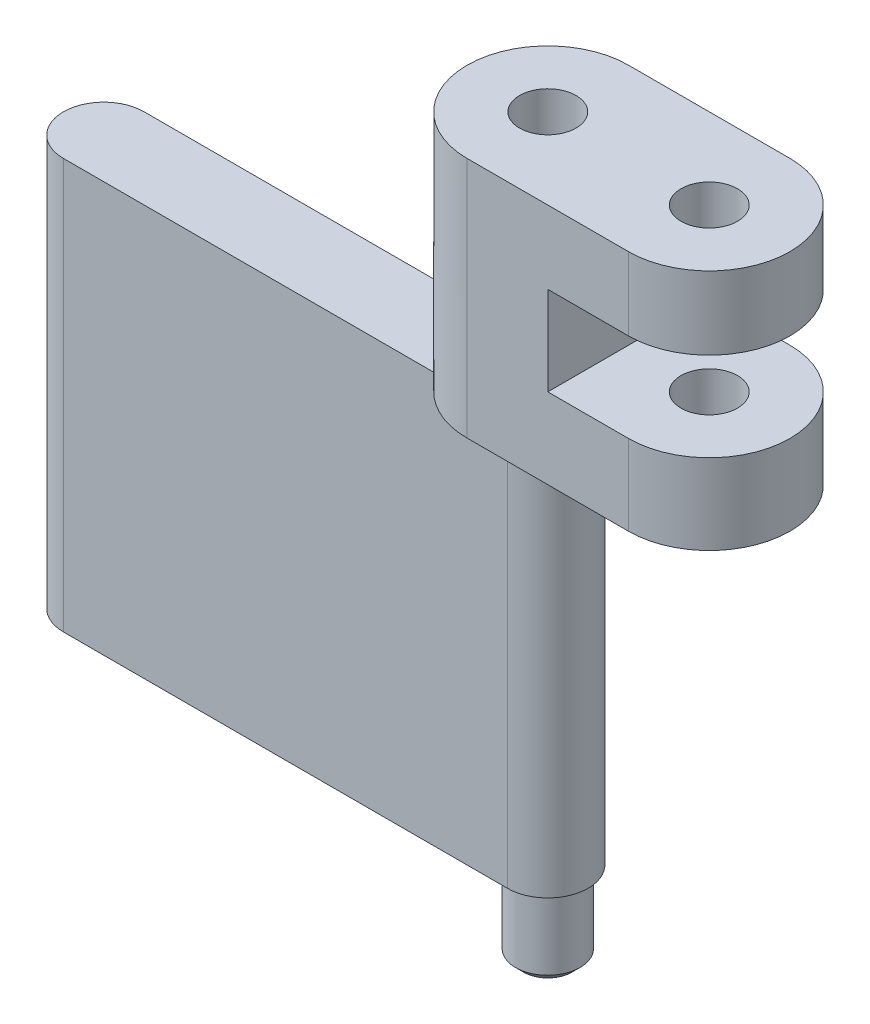
ISO-10303-21;
HEADER;
FILE_DESCRIPTION(('STEP AP214'),'2;1');
FILE_NAME('part.step','',(''),(''),'','','');
FILE_SCHEMA(('AUTOMOTIVE_DESIGN { 1 0 10303 214 1 1 1 1 }'));
ENDSEC;
DATA;
#1=APPLICATION_CONTEXT('core data for automotive mechanical design processes');
#2=APPLICATION_PROTOCOL_DEFINITION('international standard','automotive_design',2000,#1);
#3=PRODUCT_CONTEXT('',#1,'mechanical');
#4=PRODUCT('Part','Part','',(#3));
#5=PRODUCT_RELATED_PRODUCT_CATEGORY('part','',(#4));
#6=PRODUCT_DEFINITION_FORMATION('','',#4);
#7=PRODUCT_DEFINITION_CONTEXT('part definition',#1,'design');
#8=PRODUCT_DEFINITION('design','',#6,#7);
#9=PRODUCT_DEFINITION_SHAPE('','',#8);
#10=(LENGTH_UNIT() NAMED_UNIT(*) SI_UNIT(.MILLI.,.METRE.));
#11=(NAMED_UNIT(*) PLANE_ANGLE_UNIT() SI_UNIT($,.RADIAN.));
#12=(NAMED_UNIT(*) SI_UNIT($,.STERADIAN.) SOLID_ANGLE_UNIT());
#13=UNCERTAINTY_MEASURE_WITH_UNIT(LENGTH_MEASURE(1.E-05),#10,'distance_accuracy_value','');
#14=(GEOMETRIC_REPRESENTATION_CONTEXT(3) GLOBAL_UNCERTAINTY_ASSIGNED_CONTEXT((#13)) GLOBAL_UNIT_ASSIGNED_CONTEXT((#10,
#11,#12)) REPRESENTATION_CONTEXT('',''));
#15=CARTESIAN_POINT('',(0.,0.,0.));
#16=DIRECTION('',(0.,0.,1.));
#17=DIRECTION('',(1.,0.,0.));
#18=AXIS2_PLACEMENT_3D('',#15,#16,#17);
#19=CARTESIAN_POINT('',(10.,30.,0.));
#20=DIRECTION('',(0.,-1.,0.));
#21=DIRECTION('',(0.,0.,-1.));
#22=AXIS2_PLACEMENT_3D('',#19,#20,#21);
#23=CYLINDRICAL_SURFACE('',#22,10.);
#24=DIRECTION('',(0.,-1.,0.));
#25=VECTOR('',#24,1.);
#26=CARTESIAN_POINT('',(10.,30.,10.));
#27=LINE('',#26,#25);
#28=CARTESIAN_POINT('',(10.,30.,10.));
#29=VERTEX_POINT('',#28);
#30=CARTESIAN_POINT('',(10.,20.9567202086117,10.));
#31=VERTEX_POINT('',#30);
#32=EDGE_CURVE('E284',#29,#31,#27,.T.);
#33=ORIENTED_EDGE('',*,*,#32,.T.);
#34=CARTESIAN_POINT('',(10.,20.9567202086117,0.));
#35=DIRECTION('',(0.,1.,0.));
#36=DIRECTION('',(0.,0.,1.));
#37=AXIS2_PLACEMENT_3D('',#34,#35,#36);
#38=CIRCLE('',#37,10.);
#39=CARTESIAN_POINT('',(10.,20.9567202086117,-10.));
#40=VERTEX_POINT('',#39);
#41=EDGE_CURVE('E205',#31,#40,#38,.T.);
#42=ORIENTED_EDGE('',*,*,#41,.T.);
#43=DIRECTION('',(0.,-1.,0.));
#44=VECTOR('',#43,1.);
#45=CARTESIAN_POINT('',(10.,30.,-10.));
#46=LINE('',#45,#44);
#47=CARTESIAN_POINT('',(10.,30.,-10.));
#48=VERTEX_POINT('',#47);
#49=EDGE_CURVE('E281',#48,#40,#46,.T.);
#50=ORIENTED_EDGE('',*,*,#49,.F.);
#51=CARTESIAN_POINT('',(10.,30.,0.));
#52=DIRECTION('',(0.,1.,0.));
#53=DIRECTION('',(0.,0.,1.));
#54=AXIS2_PLACEMENT_3D('',#51,#52,#53);
#55=CIRCLE('',#54,10.);
#56=EDGE_CURVE('E262',#29,#48,#55,.T.);
#57=ORIENTED_EDGE('',*,*,#56,.F.);
#58=EDGE_LOOP('',(#33,#42,#50,#57));
#59=FACE_BOUND('',#58,.T.);
#60=ADVANCED_FACE('F75',(#59),#23,.T.);
#61=CARTESIAN_POINT('',(10.,30.,0.));
#62=DIRECTION('',(0.,-1.,0.));
#63=DIRECTION('',(0.,0.,-1.));
#64=AXIS2_PLACEMENT_3D('',#61,#62,#63);
#65=CYLINDRICAL_SURFACE('',#64,3.5);
#66=CARTESIAN_POINT('',(10.,20.9567202086117,0.));
#67=DIRECTION('',(0.,1.,0.));
#68=DIRECTION('',(0.,0.,1.));
#69=AXIS2_PLACEMENT_3D('',#66,#67,#68);
#70=CIRCLE('',#69,3.5);
#71=CARTESIAN_POINT('',(10.,20.9567202086117,3.5));
#72=VERTEX_POINT('',#71);
#73=EDGE_CURVE('E80',#72,#72,#70,.T.);
#74=ORIENTED_EDGE('',*,*,#73,.F.);
#75=EDGE_LOOP('',(#74));
#76=FACE_BOUND('',#75,.T.);
#77=CARTESIAN_POINT('',(10.,30.,0.));
#78=DIRECTION('',(0.,1.,0.));
#79=DIRECTION('',(0.,0.,1.));
#80=AXIS2_PLACEMENT_3D('',#77,#78,#79);
#81=CIRCLE('',#80,3.5);
#82=CARTESIAN_POINT('',(10.,30.,3.5));
#83=VERTEX_POINT('',#82);
#84=EDGE_CURVE('E244',#83,#83,#81,.T.);
#85=ORIENTED_EDGE('',*,*,#84,.T.);
#86=EDGE_LOOP('',(#85));
#87=FACE_BOUND('',#86,.T.);
#88=ADVANCED_FACE('F301',(#76,#87),#65,.F.);
#89=CARTESIAN_POINT('',(-10.,0.,0.));
#90=DIRECTION('',(0.,1.,0.));
#91=DIRECTION('',(0.,0.,1.));
#92=AXIS2_PLACEMENT_3D('',#89,#90,#91);
#93=PLANE('',#92);
#94=CARTESIAN_POINT('',(10.,0.,0.));
#95=DIRECTION('',(0.,1.,0.));
#96=DIRECTION('',(0.,0.,1.));
#97=AXIS2_PLACEMENT_3D('',#94,#95,#96);
#98=CIRCLE('',#97,3.5);
#99=CARTESIAN_POINT('',(10.,0.,3.5));
#100=VERTEX_POINT('',#99);
#101=EDGE_CURVE('E243',#100,#100,#98,.T.);
#102=ORIENTED_EDGE('',*,*,#101,.T.);
#103=EDGE_LOOP('',(#102));
#104=FACE_BOUND('',#103,.T.);
#105=DIRECTION('',(1.,0.,0.));
#106=VECTOR('',#105,1.);
#107=CARTESIAN_POINT('',(-10.,0.,-5.));
#108=LINE('',#107,#106);
#109=CARTESIAN_POINT('',(-18.6602540378444,0.,-5.));
#110=VERTEX_POINT('',#109);
#111=CARTESIAN_POINT('',(-10.,0.,-5.));
#112=VERTEX_POINT('',#111);
#113=EDGE_CURVE('E231',#110,#112,#108,.T.);
#114=ORIENTED_EDGE('',*,*,#113,.F.);
#115=CARTESIAN_POINT('',(-10.,0.,0.));
#116=DIRECTION('',(0.,1.,0.));
#117=DIRECTION('',(0.,0.,1.));
#118=AXIS2_PLACEMENT_3D('',#115,#116,#117);
#119=CIRCLE('',#118,10.);
#120=CARTESIAN_POINT('',(-10.,0.,-10.));
#121=VERTEX_POINT('',#120);
#122=EDGE_CURVE('E268',#121,#110,#119,.T.);
#123=ORIENTED_EDGE('',*,*,#122,.F.);
#124=DIRECTION('',(1.,0.,0.));
#125=VECTOR('',#124,1.);
#126=CARTESIAN_POINT('',(-10.,0.,-10.));
#127=LINE('',#126,#125);
#128=CARTESIAN_POINT('',(10.,0.,-10.));
#129=VERTEX_POINT('',#128);
#130=EDGE_CURVE('E260',#121,#129,#127,.T.);
#131=ORIENTED_EDGE('',*,*,#130,.T.);
#132=CARTESIAN_POINT('',(10.,0.,0.));
#133=DIRECTION('',(0.,1.,0.));
#134=DIRECTION('',(0.,0.,1.));
#135=AXIS2_PLACEMENT_3D('',#132,#133,#134);
#136=CIRCLE('',#135,10.);
#137=CARTESIAN_POINT('',(10.,0.,10.));
#138=VERTEX_POINT('',#137);
#139=EDGE_CURVE('E274',#138,#129,#136,.T.);
#140=ORIENTED_EDGE('',*,*,#139,.F.);
#141=DIRECTION('',(1.,0.,0.));
#142=VECTOR('',#141,1.);
#143=CARTESIAN_POINT('',(-10.,0.,10.));
#144=LINE('',#143,#142);
#145=CARTESIAN_POINT('',(-10.,0.,10.));
#146=VERTEX_POINT('',#145);
#147=EDGE_CURVE('E271',#146,#138,#144,.T.);
#148=ORIENTED_EDGE('',*,*,#147,.F.);
#149=CARTESIAN_POINT('',(-18.6602540378444,0.,5.));
#150=VERTEX_POINT('',#149);
#151=EDGE_CURVE('E253',#150,#146,#119,.T.);
#152=ORIENTED_EDGE('',*,*,#151,.F.);
#153=DIRECTION('',(-1.,0.,0.));
#154=VECTOR('',#153,1.);
#155=CARTESIAN_POINT('',(-10.,0.,5.));
#156=LINE('',#155,#154);
#157=CARTESIAN_POINT('',(-10.,0.,5.));
#158=VERTEX_POINT('',#157);
#159=EDGE_CURVE('E224',#158,#150,#156,.T.);
#160=ORIENTED_EDGE('',*,*,#159,.F.);
#161=CARTESIAN_POINT('',(-10.,0.,0.));
#162=DIRECTION('',(0.,-1.,0.));
#163=DIRECTION('',(0.,0.,-1.));
#164=AXIS2_PLACEMENT_3D('',#161,#162,#163);
#165=CIRCLE('',#164,5.);
#166=EDGE_CURVE('E101',#112,#158,#165,.T.);
#167=ORIENTED_EDGE('',*,*,#166,.F.);
#168=EDGE_LOOP('',(#114,#123,#131,#140,#148,#152,#160,#167));
#169=FACE_BOUND('',#168,.T.);
#170=ADVANCED_FACE('F304',(#104,#169),#93,.F.);
#171=CARTESIAN_POINT('',(-10.,30.,0.));
#172=DIRECTION('',(0.,1.,0.));
#173=DIRECTION('',(0.,0.,1.));
#174=AXIS2_PLACEMENT_3D('',#171,#172,#173);
#175=PLANE('',#174);
#176=CARTESIAN_POINT('',(-10.,30.,0.));
#177=DIRECTION('',(0.,1.,0.));
#178=DIRECTION('',(0.,0.,1.));
#179=AXIS2_PLACEMENT_3D('',#176,#177,#178);
#180=CIRCLE('',#179,3.5);
#181=CARTESIAN_POINT('',(-10.,30.,3.5));
#182=VERTEX_POINT('',#181);
#183=EDGE_CURVE('E250',#182,#182,#180,.T.);
#184=ORIENTED_EDGE('',*,*,#183,.F.);
#185=EDGE_LOOP('',(#184));
#186=FACE_BOUND('',#185,.T.);
#187=CARTESIAN_POINT('',(-10.,30.,0.));
#188=DIRECTION('',(0.,1.,0.));
#189=DIRECTION('',(0.,0.,1.));
#190=AXIS2_PLACEMENT_3D('',#187,#188,#189);
#191=CIRCLE('',#190,10.);
#192=CARTESIAN_POINT('',(-10.,30.,-10.));
#193=VERTEX_POINT('',#192);
#194=CARTESIAN_POINT('',(-10.,30.,10.));
#195=VERTEX_POINT('',#194);
#196=EDGE_CURVE('E256',#193,#195,#191,.T.);
#197=ORIENTED_EDGE('',*,*,#196,.T.);
#198=DIRECTION('',(1.,0.,0.));
#199=VECTOR('',#198,1.);
#200=CARTESIAN_POINT('',(-10.,30.,10.));
#201=LINE('',#200,#199);
#202=EDGE_CURVE('E259',#195,#29,#201,.T.);
#203=ORIENTED_EDGE('',*,*,#202,.T.);
#204=ORIENTED_EDGE('',*,*,#56,.T.);
#205=DIRECTION('',(1.,0.,0.));
#206=VECTOR('',#205,1.);
#207=CARTESIAN_POINT('',(-10.,30.,-10.));
#208=LINE('',#207,#206);
#209=EDGE_CURVE('E264',#193,#48,#208,.T.);
#210=ORIENTED_EDGE('',*,*,#209,.F.);
#211=EDGE_LOOP('',(#197,#203,#204,#210));
#212=FACE_BOUND('',#211,.T.);
#213=ORIENTED_EDGE('',*,*,#84,.F.);
#214=EDGE_LOOP('',(#213));
#215=FACE_BOUND('',#214,.T.);
#216=ADVANCED_FACE('F306',(#186,#212,#215),#175,.T.);
#217=CARTESIAN_POINT('',(-10.,30.,0.));
#218=DIRECTION('',(0.,-1.,0.));
#219=DIRECTION('',(0.,0.,-1.));
#220=AXIS2_PLACEMENT_3D('',#217,#218,#219);
#221=CYLINDRICAL_SURFACE('',#220,10.);
#222=ORIENTED_EDGE('',*,*,#122,.T.);
#223=EDGE_CURVE('E272',#110,#150,#119,.T.);
#224=ORIENTED_EDGE('',*,*,#223,.T.);
#225=ORIENTED_EDGE('',*,*,#151,.T.);
#226=DIRECTION('',(0.,-1.,0.));
#227=VECTOR('',#226,1.);
#228=CARTESIAN_POINT('',(-10.,30.,10.));
#229=LINE('',#228,#227);
#230=EDGE_CURVE('E287',#195,#146,#229,.T.);
#231=ORIENTED_EDGE('',*,*,#230,.F.);
#232=ORIENTED_EDGE('',*,*,#196,.F.);
#233=DIRECTION('',(0.,-1.,0.));
#234=VECTOR('',#233,1.);
#235=CARTESIAN_POINT('',(-10.,30.,-10.));
#236=LINE('',#235,#234);
#237=EDGE_CURVE('E267',#193,#121,#236,.T.);
#238=ORIENTED_EDGE('',*,*,#237,.T.);
#239=EDGE_LOOP('',(#222,#224,#225,#231,#232,#238));
#240=FACE_BOUND('',#239,.T.);
#241=ADVANCED_FACE('F314',(#240),#221,.T.);
#242=CARTESIAN_POINT('',(-10.,30.,10.));
#243=DIRECTION('',(0.,0.,-1.));
#244=DIRECTION('',(-1.,0.,0.));
#245=AXIS2_PLACEMENT_3D('',#242,#243,#244);
#246=PLANE('',#245);
#247=DIRECTION('',(0.,1.,0.));
#248=VECTOR('',#247,1.);
#249=CARTESIAN_POINT('',(0.,20.9567202086117,10.));
#250=LINE('',#249,#248);
#251=CARTESIAN_POINT('',(0.,9.95672020861171,10.));
#252=VERTEX_POINT('',#251);
#253=CARTESIAN_POINT('',(0.,20.9567202086117,10.));
#254=VERTEX_POINT('',#253);
#255=EDGE_CURVE('E184',#252,#254,#250,.T.);
#256=ORIENTED_EDGE('',*,*,#255,.T.);
#257=DIRECTION('',(1.,0.,0.));
#258=VECTOR('',#257,1.);
#259=CARTESIAN_POINT('',(30.,20.9567202086117,10.));
#260=LINE('',#259,#258);
#261=EDGE_CURVE('E181',#254,#31,#260,.T.);
#262=ORIENTED_EDGE('',*,*,#261,.T.);
#263=ORIENTED_EDGE('',*,*,#32,.F.);
#264=ORIENTED_EDGE('',*,*,#202,.F.);
#265=ORIENTED_EDGE('',*,*,#230,.T.);
#266=ORIENTED_EDGE('',*,*,#147,.T.);
#267=CARTESIAN_POINT('',(10.,9.95672020861171,10.));
#268=VERTEX_POINT('',#267);
#269=EDGE_CURVE('E193',#268,#138,#27,.T.);
#270=ORIENTED_EDGE('',*,*,#269,.F.);
#271=DIRECTION('',(-1.,0.,0.));
#272=VECTOR('',#271,1.);
#273=CARTESIAN_POINT('',(30.,9.95672020861171,10.));
#274=LINE('',#273,#272);
#275=EDGE_CURVE('E175',#268,#252,#274,.T.);
#276=ORIENTED_EDGE('',*,*,#275,.T.);
#277=EDGE_LOOP('',(#256,#262,#263,#264,#265,#266,#270,#276));
#278=FACE_BOUND('',#277,.T.);
#279=ADVANCED_FACE('F191',(#278),#246,.F.);
#280=CARTESIAN_POINT('',(10.,9.95672020861171,-10.));
#281=VERTEX_POINT('',#280);
#282=EDGE_CURVE('E280',#281,#129,#46,.T.);
#283=ORIENTED_EDGE('',*,*,#282,.F.);
#284=CARTESIAN_POINT('',(10.,9.95672020861171,0.));
#285=DIRECTION('',(0.,-1.,0.));
#286=DIRECTION('',(0.,0.,-1.));
#287=AXIS2_PLACEMENT_3D('',#284,#285,#286);
#288=CIRCLE('',#287,10.);
#289=EDGE_CURVE('E93',#281,#268,#288,.T.);
#290=ORIENTED_EDGE('',*,*,#289,.T.);
#291=ORIENTED_EDGE('',*,*,#269,.T.);
#292=ORIENTED_EDGE('',*,*,#139,.T.);
#293=EDGE_LOOP('',(#283,#290,#291,#292));
#294=FACE_BOUND('',#293,.T.);
#295=ADVANCED_FACE('F345',(#294),#23,.T.);
#296=CARTESIAN_POINT('',(-10.,30.,-10.));
#297=DIRECTION('',(0.,0.,-1.));
#298=DIRECTION('',(-1.,0.,0.));
#299=AXIS2_PLACEMENT_3D('',#296,#297,#298);
#300=PLANE('',#299);
#301=DIRECTION('',(1.,0.,0.));
#302=VECTOR('',#301,1.);
#303=CARTESIAN_POINT('',(30.,20.9567202086117,-10.));
#304=LINE('',#303,#302);
#305=CARTESIAN_POINT('',(0.,20.9567202086117,-10.));
#306=VERTEX_POINT('',#305);
#307=EDGE_CURVE('E194',#306,#40,#304,.T.);
#308=ORIENTED_EDGE('',*,*,#307,.F.);
#309=DIRECTION('',(0.,1.,0.));
#310=VECTOR('',#309,1.);
#311=CARTESIAN_POINT('',(0.,20.9567202086117,-10.));
#312=LINE('',#311,#310);
#313=CARTESIAN_POINT('',(0.,9.95672020861171,-10.));
#314=VERTEX_POINT('',#313);
#315=EDGE_CURVE('E196',#314,#306,#312,.T.);
#316=ORIENTED_EDGE('',*,*,#315,.F.);
#317=DIRECTION('',(-1.,0.,0.));
#318=VECTOR('',#317,1.);
#319=CARTESIAN_POINT('',(30.,9.95672020861171,-10.));
#320=LINE('',#319,#318);
#321=EDGE_CURVE('E176',#281,#314,#320,.T.);
#322=ORIENTED_EDGE('',*,*,#321,.F.);
#323=ORIENTED_EDGE('',*,*,#282,.T.);
#324=ORIENTED_EDGE('',*,*,#130,.F.);
#325=ORIENTED_EDGE('',*,*,#237,.F.);
#326=ORIENTED_EDGE('',*,*,#209,.T.);
#327=ORIENTED_EDGE('',*,*,#49,.T.);
#328=EDGE_LOOP('',(#308,#316,#322,#323,#324,#325,#326,#327));
#329=FACE_BOUND('',#328,.T.);
#330=ADVANCED_FACE('F342',(#329),#300,.T.);
#331=CARTESIAN_POINT('',(-10.,30.,0.));
#332=DIRECTION('',(0.,-1.,0.));
#333=DIRECTION('',(0.,0.,-1.));
#334=AXIS2_PLACEMENT_3D('',#331,#332,#333);
#335=CYLINDRICAL_SURFACE('',#334,3.5);
#336=ORIENTED_EDGE('',*,*,#183,.T.);
#337=EDGE_LOOP('',(#336));
#338=FACE_BOUND('',#337,.T.);
#339=CARTESIAN_POINT('',(-10.,0.,0.));
#340=DIRECTION('',(0.,1.,0.));
#341=DIRECTION('',(0.,0.,1.));
#342=AXIS2_PLACEMENT_3D('',#339,#340,#341);
#343=CIRCLE('',#342,3.5);
#344=CARTESIAN_POINT('',(-10.,0.,3.5));
#345=VERTEX_POINT('',#344);
#346=EDGE_CURVE('E247',#345,#345,#343,.T.);
#347=ORIENTED_EDGE('',*,*,#346,.F.);
#348=EDGE_LOOP('',(#347));
#349=FACE_BOUND('',#348,.T.);
#350=ADVANCED_FACE('F299',(#338,#349),#335,.F.);
#351=CARTESIAN_POINT('',(10.,9.95672020861171,0.));
#352=DIRECTION('',(0.,-1.,0.));
#353=DIRECTION('',(0.,0.,-1.));
#354=AXIS2_PLACEMENT_3D('',#351,#352,#353);
#355=CIRCLE('',#354,3.5);
#356=CARTESIAN_POINT('',(10.,9.95672020861171,-3.5));
#357=VERTEX_POINT('',#356);
#358=EDGE_CURVE('E202',#357,#357,#355,.T.);
#359=ORIENTED_EDGE('',*,*,#358,.F.);
#360=EDGE_LOOP('',(#359));
#361=FACE_BOUND('',#360,.T.);
#362=ORIENTED_EDGE('',*,*,#101,.F.);
#363=EDGE_LOOP('',(#362));
#364=FACE_BOUND('',#363,.T.);
#365=ADVANCED_FACE('F295',(#361,#364),#65,.F.);
#366=CARTESIAN_POINT('',(-10.,0.,0.));
#367=DIRECTION('',(0.,-1.,0.));
#368=DIRECTION('',(0.,0.,-1.));
#369=AXIS2_PLACEMENT_3D('',#366,#367,#368);
#370=PLANE('',#369);
#371=ORIENTED_EDGE('',*,*,#223,.F.);
#372=CARTESIAN_POINT('',(-65.,0.,-5.));
#373=VERTEX_POINT('',#372);
#374=EDGE_CURVE('E215',#373,#110,#108,.T.);
#375=ORIENTED_EDGE('',*,*,#374,.F.);
#376=CARTESIAN_POINT('',(-65.,0.,0.));
#377=DIRECTION('',(0.,-1.,0.));
#378=DIRECTION('',(0.,0.,-1.));
#379=AXIS2_PLACEMENT_3D('',#376,#377,#378);
#380=CIRCLE('',#379,5.);
#381=CARTESIAN_POINT('',(-65.,0.,4.99999999999999));
#382=VERTEX_POINT('',#381);
#383=EDGE_CURVE('E227',#382,#373,#380,.T.);
#384=ORIENTED_EDGE('',*,*,#383,.F.);
#385=EDGE_CURVE('E223',#150,#382,#156,.T.);
#386=ORIENTED_EDGE('',*,*,#385,.F.);
#387=EDGE_LOOP('',(#371,#375,#384,#386));
#388=FACE_BOUND('',#387,.T.);
#389=ADVANCED_FACE('F298',(#388),#370,.F.);
#390=CARTESIAN_POINT('',(-10.,-50.8,0.));
#391=DIRECTION('',(0.,-1.,0.));
#392=DIRECTION('',(0.,0.,-1.));
#393=AXIS2_PLACEMENT_3D('',#390,#391,#392);
#394=PLANE('',#393);
#395=CARTESIAN_POINT('',(-10.,-50.8,0.));
#396=DIRECTION('',(0.,-1.,0.));
#397=DIRECTION('',(0.,0.,-1.));
#398=AXIS2_PLACEMENT_3D('',#395,#396,#397);
#399=CIRCLE('',#398,4.);
#400=CARTESIAN_POINT('',(-10.,-50.8,-3.99999999999992));
#401=VERTEX_POINT('',#400);
#402=EDGE_CURVE('E208',#401,#401,#399,.T.);
#403=ORIENTED_EDGE('',*,*,#402,.F.);
#404=EDGE_LOOP('',(#403));
#405=FACE_BOUND('',#404,.T.);
#406=CARTESIAN_POINT('',(-10.,-50.8,0.));
#407=DIRECTION('',(0.,-1.,0.));
#408=DIRECTION('',(0.,0.,-1.));
#409=AXIS2_PLACEMENT_3D('',#406,#407,#408);
#410=CIRCLE('',#409,5.);
#411=CARTESIAN_POINT('',(-10.,-50.8,-5.));
#412=VERTEX_POINT('',#411);
#413=CARTESIAN_POINT('',(-10.,-50.8,5.));
#414=VERTEX_POINT('',#413);
#415=EDGE_CURVE('E211',#412,#414,#410,.T.);
#416=ORIENTED_EDGE('',*,*,#415,.T.);
#417=DIRECTION('',(-1.,0.,0.));
#418=VECTOR('',#417,1.);
#419=CARTESIAN_POINT('',(-10.,-50.8,5.));
#420=LINE('',#419,#418);
#421=CARTESIAN_POINT('',(-65.,-50.8,4.99999999999999));
#422=VERTEX_POINT('',#421);
#423=EDGE_CURVE('E214',#414,#422,#420,.T.);
#424=ORIENTED_EDGE('',*,*,#423,.T.);
#425=CARTESIAN_POINT('',(-65.,-50.8,0.));
#426=DIRECTION('',(0.,-1.,0.));
#427=DIRECTION('',(0.,0.,-1.));
#428=AXIS2_PLACEMENT_3D('',#425,#426,#427);
#429=CIRCLE('',#428,5.);
#430=CARTESIAN_POINT('',(-65.,-50.8,-5.));
#431=VERTEX_POINT('',#430);
#432=EDGE_CURVE('E217',#422,#431,#429,.T.);
#433=ORIENTED_EDGE('',*,*,#432,.T.);
#434=DIRECTION('',(1.,0.,0.));
#435=VECTOR('',#434,1.);
#436=CARTESIAN_POINT('',(-10.,-50.8,-5.));
#437=LINE('',#436,#435);
#438=EDGE_CURVE('E219',#431,#412,#437,.T.);
#439=ORIENTED_EDGE('',*,*,#438,.T.);
#440=EDGE_LOOP('',(#416,#424,#433,#439));
#441=FACE_BOUND('',#440,.T.);
#442=ADVANCED_FACE('F384',(#405,#441),#394,.T.);
#443=CARTESIAN_POINT('',(-10.,-50.8,-5.));
#444=DIRECTION('',(0.,0.,1.));
#445=DIRECTION('',(1.,0.,0.));
#446=AXIS2_PLACEMENT_3D('',#443,#444,#445);
#447=PLANE('',#446);
#448=ORIENTED_EDGE('',*,*,#374,.T.);
#449=ORIENTED_EDGE('',*,*,#113,.T.);
#450=DIRECTION('',(0.,1.,0.));
#451=VECTOR('',#450,1.);
#452=CARTESIAN_POINT('',(-10.,-50.8,-5.));
#453=LINE('',#452,#451);
#454=EDGE_CURVE('E221',#412,#112,#453,.T.);
#455=ORIENTED_EDGE('',*,*,#454,.F.);
#456=ORIENTED_EDGE('',*,*,#438,.F.);
#457=DIRECTION('',(0.,1.,0.));
#458=VECTOR('',#457,1.);
#459=CARTESIAN_POINT('',(-65.,-50.8,-5.));
#460=LINE('',#459,#458);
#461=EDGE_CURVE('E234',#431,#373,#460,.T.);
#462=ORIENTED_EDGE('',*,*,#461,.T.);
#463=EDGE_LOOP('',(#448,#449,#455,#456,#462));
#464=FACE_BOUND('',#463,.T.);
#465=ADVANCED_FACE('F321',(#464),#447,.F.);
#466=CARTESIAN_POINT('',(-65.,-50.8,0.));
#467=DIRECTION('',(0.,1.,0.));
#468=DIRECTION('',(0.,0.,1.));
#469=AXIS2_PLACEMENT_3D('',#466,#467,#468);
#470=CYLINDRICAL_SURFACE('',#469,5.);
#471=ORIENTED_EDGE('',*,*,#383,.T.);
#472=ORIENTED_EDGE('',*,*,#461,.F.);
#473=ORIENTED_EDGE('',*,*,#432,.F.);
#474=DIRECTION('',(0.,1.,0.));
#475=VECTOR('',#474,1.);
#476=CARTESIAN_POINT('',(-65.,-50.8,4.99999999999999));
#477=LINE('',#476,#475);
#478=EDGE_CURVE('E237',#422,#382,#477,.T.);
#479=ORIENTED_EDGE('',*,*,#478,.T.);
#480=EDGE_LOOP('',(#471,#472,#473,#479));
#481=FACE_BOUND('',#480,.T.);
#482=ADVANCED_FACE('F326',(#481),#470,.T.);
#483=CARTESIAN_POINT('',(-10.,-50.8,5.));
#484=DIRECTION('',(0.,0.,-1.));
#485=DIRECTION('',(-1.,0.,0.));
#486=AXIS2_PLACEMENT_3D('',#483,#484,#485);
#487=PLANE('',#486);
#488=ORIENTED_EDGE('',*,*,#159,.T.);
#489=ORIENTED_EDGE('',*,*,#385,.T.);
#490=ORIENTED_EDGE('',*,*,#478,.F.);
#491=ORIENTED_EDGE('',*,*,#423,.F.);
#492=DIRECTION('',(0.,1.,0.));
#493=VECTOR('',#492,1.);
#494=CARTESIAN_POINT('',(-10.,-50.8,5.));
#495=LINE('',#494,#493);
#496=EDGE_CURVE('E240',#414,#158,#495,.T.);
#497=ORIENTED_EDGE('',*,*,#496,.T.);
#498=EDGE_LOOP('',(#488,#489,#490,#491,#497));
#499=FACE_BOUND('',#498,.T.);
#500=ADVANCED_FACE('F329',(#499),#487,.F.);
#501=CARTESIAN_POINT('',(-10.,-50.8,0.));
#502=DIRECTION('',(0.,1.,0.));
#503=DIRECTION('',(0.,0.,1.));
#504=AXIS2_PLACEMENT_3D('',#501,#502,#503);
#505=CYLINDRICAL_SURFACE('',#504,5.);
#506=ORIENTED_EDGE('',*,*,#166,.T.);
#507=ORIENTED_EDGE('',*,*,#496,.F.);
#508=ORIENTED_EDGE('',*,*,#415,.F.);
#509=ORIENTED_EDGE('',*,*,#454,.T.);
#510=EDGE_LOOP('',(#506,#507,#508,#509));
#511=FACE_BOUND('',#510,.T.);
#512=ADVANCED_FACE('F396',(#511),#505,.T.);
#513=ORIENTED_EDGE('',*,*,#346,.T.);
#514=EDGE_LOOP('',(#513));
#515=FACE_BOUND('',#514,.T.);
#516=ADVANCED_FACE('F382',(#515),#370,.F.);
#517=CARTESIAN_POINT('',(-10.,-60.8,0.));
#518=DIRECTION('',(0.,1.,0.));
#519=DIRECTION('',(0.,0.,1.));
#520=AXIS2_PLACEMENT_3D('',#517,#518,#519);
#521=CYLINDRICAL_SURFACE('',#520,4.);
#522=CARTESIAN_POINT('',(-10.,-59.8,0.));
#523=DIRECTION('',(0.,-1.,0.));
#524=DIRECTION('',(0.,0.,-1.));
#525=AXIS2_PLACEMENT_3D('',#522,#523,#524);
#526=CIRCLE('',#525,4.);
#527=CARTESIAN_POINT('',(-10.,-59.8,-3.99999999999992));
#528=VERTEX_POINT('',#527);
#529=EDGE_CURVE('E12',#528,#528,#526,.F.);
#530=ORIENTED_EDGE('',*,*,#529,.T.);
#531=EDGE_LOOP('',(#530));
#532=FACE_BOUND('',#531,.T.);
#533=ORIENTED_EDGE('',*,*,#402,.T.);
#534=EDGE_LOOP('',(#533));
#535=FACE_BOUND('',#534,.T.);
#536=ADVANCED_FACE('F378',(#532,#535),#521,.T.);
#537=CARTESIAN_POINT('',(-10.,-60.8,0.));
#538=DIRECTION('',(0.,-1.,0.));
#539=DIRECTION('',(0.,0.,-1.));
#540=AXIS2_PLACEMENT_3D('',#537,#538,#539);
#541=PLANE('',#540);
#542=CARTESIAN_POINT('',(-10.,-60.8,0.));
#543=DIRECTION('',(0.,-1.,0.));
#544=DIRECTION('',(0.,0.,-1.));
#545=AXIS2_PLACEMENT_3D('',#542,#543,#544);
#546=CIRCLE('',#545,3.00000000000002);
#547=CARTESIAN_POINT('',(-10.,-60.8,-2.99999999999994));
#548=VERTEX_POINT('',#547);
#549=EDGE_CURVE('E85',#548,#548,#546,.T.);
#550=ORIENTED_EDGE('',*,*,#549,.T.);
#551=EDGE_LOOP('',(#550));
#552=FACE_BOUND('',#551,.T.);
#553=ADVANCED_FACE('F370',(#552),#541,.T.);
#554=CARTESIAN_POINT('',(-10.,-60.8,0.));
#555=DIRECTION('',(0.,1.,0.));
#556=DIRECTION('',(0.,0.,1.));
#557=AXIS2_PLACEMENT_3D('',#554,#555,#556);
#558=CONICAL_SURFACE('',#557,3.00000000000002,0.785398163397439);
#559=ORIENTED_EDGE('',*,*,#529,.F.);
#560=EDGE_LOOP('',(#559));
#561=FACE_BOUND('',#560,.T.);
#562=ORIENTED_EDGE('',*,*,#549,.F.);
#563=EDGE_LOOP('',(#562));
#564=FACE_BOUND('',#563,.T.);
#565=ADVANCED_FACE('F78',(#561,#564),#558,.T.);
#566=CARTESIAN_POINT('',(30.,20.9567202086117,10.));
#567=DIRECTION('',(0.,1.,0.));
#568=DIRECTION('',(0.,0.,1.));
#569=AXIS2_PLACEMENT_3D('',#566,#567,#568);
#570=PLANE('',#569);
#571=ORIENTED_EDGE('',*,*,#73,.T.);
#572=EDGE_LOOP('',(#571));
#573=FACE_BOUND('',#572,.T.);
#574=ORIENTED_EDGE('',*,*,#261,.F.);
#575=DIRECTION('',(0.,0.,-1.));
#576=VECTOR('',#575,1.);
#577=CARTESIAN_POINT('',(0.,20.9567202086117,10.));
#578=LINE('',#577,#576);
#579=EDGE_CURVE('E180',#254,#306,#578,.T.);
#580=ORIENTED_EDGE('',*,*,#579,.T.);
#581=ORIENTED_EDGE('',*,*,#307,.T.);
#582=ORIENTED_EDGE('',*,*,#41,.F.);
#583=EDGE_LOOP('',(#574,#580,#581,#582));
#584=FACE_BOUND('',#583,.T.);
#585=ADVANCED_FACE('F362',(#573,#584),#570,.F.);
#586=CARTESIAN_POINT('',(30.,9.95672020861171,10.));
#587=DIRECTION('',(0.,-1.,0.));
#588=DIRECTION('',(0.,0.,-1.));
#589=AXIS2_PLACEMENT_3D('',#586,#587,#588);
#590=PLANE('',#589);
#591=ORIENTED_EDGE('',*,*,#358,.T.);
#592=EDGE_LOOP('',(#591));
#593=FACE_BOUND('',#592,.T.);
#594=ORIENTED_EDGE('',*,*,#321,.T.);
#595=DIRECTION('',(0.,0.,-1.));
#596=VECTOR('',#595,1.);
#597=CARTESIAN_POINT('',(0.,9.95672020861171,10.));
#598=LINE('',#597,#596);
#599=EDGE_CURVE('E171',#252,#314,#598,.T.);
#600=ORIENTED_EDGE('',*,*,#599,.F.);
#601=ORIENTED_EDGE('',*,*,#275,.F.);
#602=ORIENTED_EDGE('',*,*,#289,.F.);
#603=EDGE_LOOP('',(#594,#600,#601,#602));
#604=FACE_BOUND('',#603,.T.);
#605=ADVANCED_FACE('F173',(#593,#604),#590,.F.);
#606=CARTESIAN_POINT('',(0.,20.9567202086117,10.));
#607=DIRECTION('',(-1.,0.,0.));
#608=DIRECTION('',(0.,0.,1.));
#609=AXIS2_PLACEMENT_3D('',#606,#607,#608);
#610=PLANE('',#609);
#611=ORIENTED_EDGE('',*,*,#315,.T.);
#612=ORIENTED_EDGE('',*,*,#579,.F.);
#613=ORIENTED_EDGE('',*,*,#255,.F.);
#614=ORIENTED_EDGE('',*,*,#599,.T.);
#615=EDGE_LOOP('',(#611,#612,#613,#614));
#616=FACE_BOUND('',#615,.T.);
#617=ADVANCED_FACE('F185',(#616),#610,.F.);
#618=CLOSED_SHELL('',(#60,#88,#170,#216,#241,#279,#295,#330,#350,#365,#389,#442,#465,#482,#500,
#512,#516,#536,#553,#565,#585,#605,#617));
#619=MANIFOLD_SOLID_BREP('B2',#618);
#620=ADVANCED_BREP_SHAPE_REPRESENTATION('',(#18,#619),#14);
#621=SHAPE_DEFINITION_REPRESENTATION(#9,#620);
ENDSEC;
END-ISO-10303-21;
